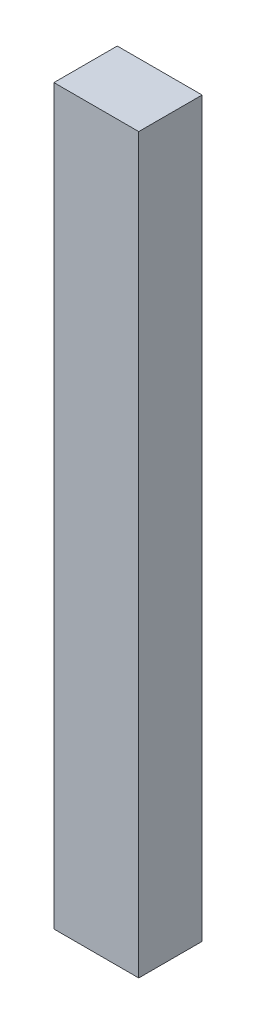
ISO-10303-21;
HEADER;
FILE_DESCRIPTION(('STEP AP214'),'2;1');
FILE_NAME('part.step','',(''),(''),'','','');
FILE_SCHEMA(('AUTOMOTIVE_DESIGN { 1 0 10303 214 1 1 1 1 }'));
ENDSEC;
DATA;
#1=APPLICATION_CONTEXT('core data for automotive mechanical design processes');
#2=APPLICATION_PROTOCOL_DEFINITION('international standard','automotive_design',2000,#1);
#3=PRODUCT_CONTEXT('',#1,'mechanical');
#4=PRODUCT('Part','Part','',(#3));
#5=PRODUCT_RELATED_PRODUCT_CATEGORY('part','',(#4));
#6=PRODUCT_DEFINITION_FORMATION('','',#4);
#7=PRODUCT_DEFINITION_CONTEXT('part definition',#1,'design');
#8=PRODUCT_DEFINITION('design','',#6,#7);
#9=PRODUCT_DEFINITION_SHAPE('','',#8);
#10=(LENGTH_UNIT() NAMED_UNIT(*) SI_UNIT(.MILLI.,.METRE.));
#11=(NAMED_UNIT(*) PLANE_ANGLE_UNIT() SI_UNIT($,.RADIAN.));
#12=(NAMED_UNIT(*) SI_UNIT($,.STERADIAN.) SOLID_ANGLE_UNIT());
#13=UNCERTAINTY_MEASURE_WITH_UNIT(LENGTH_MEASURE(1.E-05),#10,'distance_accuracy_value','');
#14=(GEOMETRIC_REPRESENTATION_CONTEXT(3) GLOBAL_UNCERTAINTY_ASSIGNED_CONTEXT((#13)) GLOBAL_UNIT_ASSIGNED_CONTEXT((#10,
#11,#12)) REPRESENTATION_CONTEXT('',''));
#15=CARTESIAN_POINT('',(0.,0.,0.));
#16=DIRECTION('',(0.,0.,1.));
#17=DIRECTION('',(1.,0.,0.));
#18=AXIS2_PLACEMENT_3D('',#15,#16,#17);
#19=CARTESIAN_POINT('',(-27.8320890870254,508.,24.5000784216773));
#20=DIRECTION('',(1.,0.,0.));
#21=DIRECTION('',(0.,0.,-1.));
#22=AXIS2_PLACEMENT_3D('',#19,#20,#21);
#23=PLANE('',#22);
#24=DIRECTION('',(0.,0.,1.));
#25=VECTOR('',#24,1.);
#26=CARTESIAN_POINT('',(-27.8320890870254,0.,24.5000784216773));
#27=LINE('',#26,#25);
#28=CARTESIAN_POINT('',(-27.8320890870254,0.,-19.4040621099685));
#29=VERTEX_POINT('',#28);
#30=CARTESIAN_POINT('',(-27.8320890870254,0.,24.5000784216773));
#31=VERTEX_POINT('',#30);
#32=EDGE_CURVE('E96',#29,#31,#27,.T.);
#33=ORIENTED_EDGE('',*,*,#32,.T.);
#34=DIRECTION('',(0.,-1.,0.));
#35=VECTOR('',#34,1.);
#36=CARTESIAN_POINT('',(-27.8320890870254,508.,24.5000784216773));
#37=LINE('',#36,#35);
#38=CARTESIAN_POINT('',(-27.8320890870254,508.,24.5000784216773));
#39=VERTEX_POINT('',#38);
#40=EDGE_CURVE('E11',#39,#31,#37,.T.);
#41=ORIENTED_EDGE('',*,*,#40,.F.);
#42=DIRECTION('',(0.,0.,1.));
#43=VECTOR('',#42,1.);
#44=CARTESIAN_POINT('',(-27.8320890870254,508.,24.5000784216773));
#45=LINE('',#44,#43);
#46=CARTESIAN_POINT('',(-27.8320890870254,508.,-19.4040621099685));
#47=VERTEX_POINT('',#46);
#48=EDGE_CURVE('E84',#47,#39,#45,.T.);
#49=ORIENTED_EDGE('',*,*,#48,.F.);
#50=DIRECTION('',(0.,-1.,0.));
#51=VECTOR('',#50,1.);
#52=CARTESIAN_POINT('',(-27.8320890870254,508.,-19.4040621099685));
#53=LINE('',#52,#51);
#54=EDGE_CURVE('E92',#47,#29,#53,.T.);
#55=ORIENTED_EDGE('',*,*,#54,.T.);
#56=EDGE_LOOP('',(#33,#41,#49,#55));
#57=FACE_BOUND('',#56,.T.);
#58=ADVANCED_FACE('F33',(#57),#23,.F.);
#59=CARTESIAN_POINT('',(30.9680991250002,508.,24.5000784216773));
#60=DIRECTION('',(0.,0.,-1.));
#61=DIRECTION('',(-1.,0.,0.));
#62=AXIS2_PLACEMENT_3D('',#59,#60,#61);
#63=PLANE('',#62);
#64=DIRECTION('',(1.,0.,0.));
#65=VECTOR('',#64,1.);
#66=CARTESIAN_POINT('',(30.9680991250002,0.,24.5000784216773));
#67=LINE('',#66,#65);
#68=CARTESIAN_POINT('',(30.9680991250002,0.,24.5000784216773));
#69=VERTEX_POINT('',#68);
#70=EDGE_CURVE('E88',#31,#69,#67,.T.);
#71=ORIENTED_EDGE('',*,*,#70,.T.);
#72=DIRECTION('',(0.,-1.,0.));
#73=VECTOR('',#72,1.);
#74=CARTESIAN_POINT('',(30.9680991250002,508.,24.5000784216773));
#75=LINE('',#74,#73);
#76=CARTESIAN_POINT('',(30.9680991250002,508.,24.5000784216773));
#77=VERTEX_POINT('',#76);
#78=EDGE_CURVE('E41',#77,#69,#75,.T.);
#79=ORIENTED_EDGE('',*,*,#78,.F.);
#80=DIRECTION('',(1.,0.,0.));
#81=VECTOR('',#80,1.);
#82=CARTESIAN_POINT('',(30.9680991250002,508.,24.5000784216773));
#83=LINE('',#82,#81);
#84=EDGE_CURVE('E79',#39,#77,#83,.T.);
#85=ORIENTED_EDGE('',*,*,#84,.F.);
#86=ORIENTED_EDGE('',*,*,#40,.T.);
#87=EDGE_LOOP('',(#71,#79,#85,#86));
#88=FACE_BOUND('',#87,.T.);
#89=ADVANCED_FACE('F87',(#88),#63,.F.);
#90=CARTESIAN_POINT('',(30.9680991250002,508.,-19.4040621099685));
#91=DIRECTION('',(-1.,0.,0.));
#92=DIRECTION('',(0.,0.,1.));
#93=AXIS2_PLACEMENT_3D('',#90,#91,#92);
#94=PLANE('',#93);
#95=DIRECTION('',(0.,0.,-1.));
#96=VECTOR('',#95,1.);
#97=CARTESIAN_POINT('',(30.9680991250002,0.,-19.4040621099685));
#98=LINE('',#97,#96);
#99=CARTESIAN_POINT('',(30.9680991250002,0.,-19.4040621099685));
#100=VERTEX_POINT('',#99);
#101=EDGE_CURVE('E66',#69,#100,#98,.T.);
#102=ORIENTED_EDGE('',*,*,#101,.T.);
#103=DIRECTION('',(0.,-1.,0.));
#104=VECTOR('',#103,1.);
#105=CARTESIAN_POINT('',(30.9680991250002,508.,-19.4040621099685));
#106=LINE('',#105,#104);
#107=CARTESIAN_POINT('',(30.9680991250002,508.,-19.4040621099685));
#108=VERTEX_POINT('',#107);
#109=EDGE_CURVE('E89',#108,#100,#106,.T.);
#110=ORIENTED_EDGE('',*,*,#109,.F.);
#111=DIRECTION('',(0.,0.,-1.));
#112=VECTOR('',#111,1.);
#113=CARTESIAN_POINT('',(30.9680991250002,508.,-19.4040621099685));
#114=LINE('',#113,#112);
#115=EDGE_CURVE('E82',#77,#108,#114,.T.);
#116=ORIENTED_EDGE('',*,*,#115,.F.);
#117=ORIENTED_EDGE('',*,*,#78,.T.);
#118=EDGE_LOOP('',(#102,#110,#116,#117));
#119=FACE_BOUND('',#118,.T.);
#120=ADVANCED_FACE('F90',(#119),#94,.F.);
#121=CARTESIAN_POINT('',(-27.8320890870254,508.,-19.4040621099685));
#122=DIRECTION('',(0.,0.,1.));
#123=DIRECTION('',(1.,0.,0.));
#124=AXIS2_PLACEMENT_3D('',#121,#122,#123);
#125=PLANE('',#124);
#126=DIRECTION('',(-1.,0.,0.));
#127=VECTOR('',#126,1.);
#128=CARTESIAN_POINT('',(-27.8320890870254,0.,-19.4040621099685));
#129=LINE('',#128,#127);
#130=EDGE_CURVE('E72',#100,#29,#129,.T.);
#131=ORIENTED_EDGE('',*,*,#130,.T.);
#132=ORIENTED_EDGE('',*,*,#54,.F.);
#133=DIRECTION('',(-1.,0.,0.));
#134=VECTOR('',#133,1.);
#135=CARTESIAN_POINT('',(-27.8320890870254,508.,-19.4040621099685));
#136=LINE('',#135,#134);
#137=EDGE_CURVE('E49',#108,#47,#136,.T.);
#138=ORIENTED_EDGE('',*,*,#137,.F.);
#139=ORIENTED_EDGE('',*,*,#109,.T.);
#140=EDGE_LOOP('',(#131,#132,#138,#139));
#141=FACE_BOUND('',#140,.T.);
#142=ADVANCED_FACE('F103',(#141),#125,.F.);
#143=CARTESIAN_POINT('',(0.,508.,0.));
#144=DIRECTION('',(0.,-1.,0.));
#145=DIRECTION('',(0.,0.,-1.));
#146=AXIS2_PLACEMENT_3D('',#143,#144,#145);
#147=PLANE('',#146);
#148=ORIENTED_EDGE('',*,*,#48,.T.);
#149=ORIENTED_EDGE('',*,*,#84,.T.);
#150=ORIENTED_EDGE('',*,*,#115,.T.);
#151=ORIENTED_EDGE('',*,*,#137,.T.);
#152=EDGE_LOOP('',(#148,#149,#150,#151));
#153=FACE_BOUND('',#152,.T.);
#154=ADVANCED_FACE('F80',(#153),#147,.F.);
#155=CARTESIAN_POINT('',(0.,0.,0.));
#156=DIRECTION('',(0.,-1.,0.));
#157=DIRECTION('',(0.,0.,-1.));
#158=AXIS2_PLACEMENT_3D('',#155,#156,#157);
#159=PLANE('',#158);
#160=ORIENTED_EDGE('',*,*,#32,.F.);
#161=ORIENTED_EDGE('',*,*,#130,.F.);
#162=ORIENTED_EDGE('',*,*,#101,.F.);
#163=ORIENTED_EDGE('',*,*,#70,.F.);
#164=EDGE_LOOP('',(#160,#161,#162,#163));
#165=FACE_BOUND('',#164,.T.);
#166=ADVANCED_FACE('F106',(#165),#159,.T.);
#167=CLOSED_SHELL('',(#58,#89,#120,#142,#154,#166));
#168=MANIFOLD_SOLID_BREP('B2',#167);
#169=ADVANCED_BREP_SHAPE_REPRESENTATION('',(#18,#168),#14);
#170=SHAPE_DEFINITION_REPRESENTATION(#9,#169);
ENDSEC;
END-ISO-10303-21;
